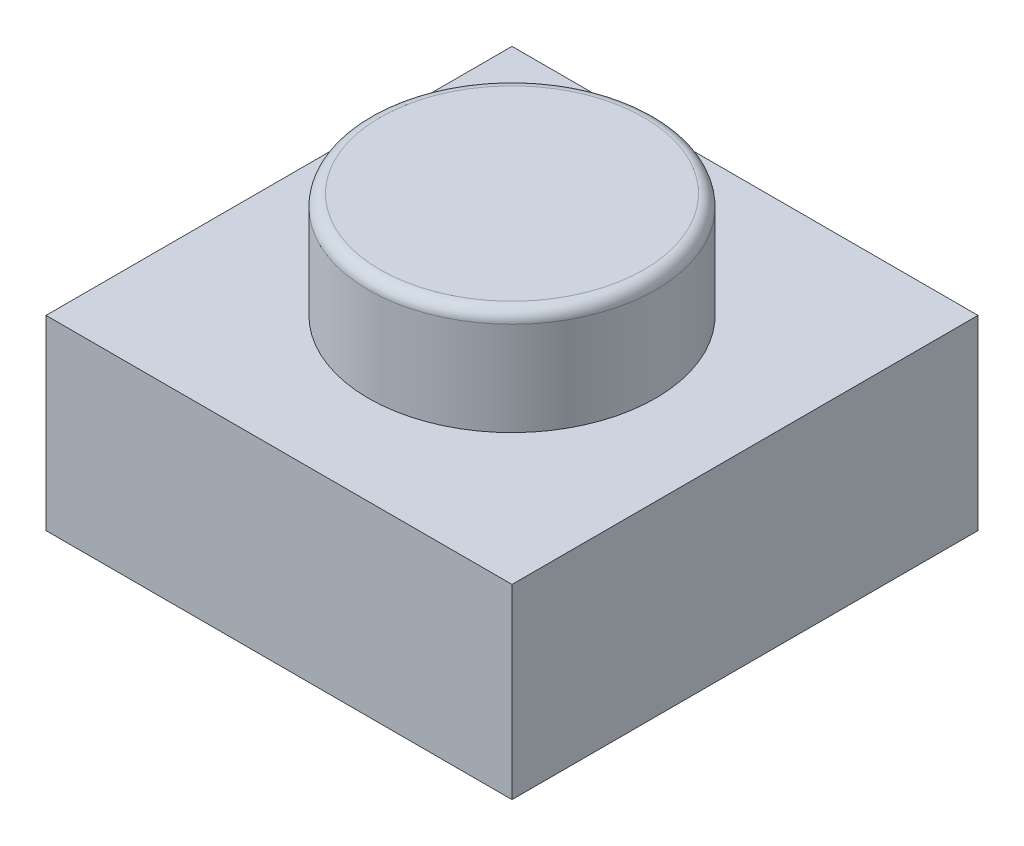
ISO-10303-21;
HEADER;
FILE_DESCRIPTION(('STEP AP214'),'2;1');
FILE_NAME('part.step','',(''),(''),'','','');
FILE_SCHEMA(('AUTOMOTIVE_DESIGN { 1 0 10303 214 1 1 1 1 }'));
ENDSEC;
DATA;
#1=APPLICATION_CONTEXT('core data for automotive mechanical design processes');
#2=APPLICATION_PROTOCOL_DEFINITION('international standard','automotive_design',2000,#1);
#3=PRODUCT_CONTEXT('',#1,'mechanical');
#4=PRODUCT('Part','Part','',(#3));
#5=PRODUCT_RELATED_PRODUCT_CATEGORY('part','',(#4));
#6=PRODUCT_DEFINITION_FORMATION('','',#4);
#7=PRODUCT_DEFINITION_CONTEXT('part definition',#1,'design');
#8=PRODUCT_DEFINITION('design','',#6,#7);
#9=PRODUCT_DEFINITION_SHAPE('','',#8);
#10=(LENGTH_UNIT() NAMED_UNIT(*) SI_UNIT(.MILLI.,.METRE.));
#11=(NAMED_UNIT(*) PLANE_ANGLE_UNIT() SI_UNIT($,.RADIAN.));
#12=(NAMED_UNIT(*) SI_UNIT($,.STERADIAN.) SOLID_ANGLE_UNIT());
#13=UNCERTAINTY_MEASURE_WITH_UNIT(LENGTH_MEASURE(1.E-05),#10,'distance_accuracy_value','');
#14=(GEOMETRIC_REPRESENTATION_CONTEXT(3) GLOBAL_UNCERTAINTY_ASSIGNED_CONTEXT((#13)) GLOBAL_UNIT_ASSIGNED_CONTEXT((#10,
#11,#12)) REPRESENTATION_CONTEXT('',''));
#15=CARTESIAN_POINT('',(0.,0.,0.));
#16=DIRECTION('',(0.,0.,1.));
#17=DIRECTION('',(1.,0.,0.));
#18=AXIS2_PLACEMENT_3D('',#15,#16,#17);
#19=CARTESIAN_POINT('',(23.6675908221797,3.18,-17.3288718929254));
#20=DIRECTION('',(0.,0.,-1.));
#21=DIRECTION('',(-1.,0.,0.));
#22=AXIS2_PLACEMENT_3D('',#19,#20,#21);
#23=PLANE('',#22);
#24=DIRECTION('',(1.,0.,0.));
#25=VECTOR('',#24,1.);
#26=CARTESIAN_POINT('',(23.6675908221797,0.,-17.3288718929254));
#27=LINE('',#26,#25);
#28=CARTESIAN_POINT('',(23.6675908221797,0.,-17.3288718929254));
#29=VERTEX_POINT('',#28);
#30=CARTESIAN_POINT('',(31.6175908221797,0.,-17.3288718929254));
#31=VERTEX_POINT('',#30);
#32=EDGE_CURVE('E103',#29,#31,#27,.T.);
#33=ORIENTED_EDGE('',*,*,#32,.F.);
#34=DIRECTION('',(0.,-1.,0.));
#35=VECTOR('',#34,1.);
#36=CARTESIAN_POINT('',(23.6675908221797,3.18,-17.3288718929254));
#37=LINE('',#36,#35);
#38=CARTESIAN_POINT('',(23.6675908221797,3.18,-17.3288718929254));
#39=VERTEX_POINT('',#38);
#40=EDGE_CURVE('E50',#39,#29,#37,.T.);
#41=ORIENTED_EDGE('',*,*,#40,.F.);
#42=DIRECTION('',(1.,0.,0.));
#43=VECTOR('',#42,1.);
#44=CARTESIAN_POINT('',(23.6675908221797,3.18,-17.3288718929254));
#45=LINE('',#44,#43);
#46=CARTESIAN_POINT('',(31.6175908221797,3.18,-17.3288718929254));
#47=VERTEX_POINT('',#46);
#48=EDGE_CURVE('E97',#39,#47,#45,.T.);
#49=ORIENTED_EDGE('',*,*,#48,.T.);
#50=DIRECTION('',(0.,-1.,0.));
#51=VECTOR('',#50,1.);
#52=CARTESIAN_POINT('',(31.6175908221797,3.18,-17.3288718929254));
#53=LINE('',#52,#51);
#54=EDGE_CURVE('E75',#47,#31,#53,.T.);
#55=ORIENTED_EDGE('',*,*,#54,.T.);
#56=EDGE_LOOP('',(#33,#41,#49,#55));
#57=FACE_BOUND('',#56,.T.);
#58=ADVANCED_FACE('F33',(#57),#23,.T.);
#59=CARTESIAN_POINT('',(23.6675908221797,3.18,-17.3288718929254));
#60=DIRECTION('',(1.,0.,0.));
#61=DIRECTION('',(0.,0.,-1.));
#62=AXIS2_PLACEMENT_3D('',#59,#60,#61);
#63=PLANE('',#62);
#64=DIRECTION('',(0.,0.,1.));
#65=VECTOR('',#64,1.);
#66=CARTESIAN_POINT('',(23.6675908221797,0.,-17.3288718929254));
#67=LINE('',#66,#65);
#68=CARTESIAN_POINT('',(23.6675908221797,0.,-9.37887189292543));
#69=VERTEX_POINT('',#68);
#70=EDGE_CURVE('E67',#29,#69,#67,.T.);
#71=ORIENTED_EDGE('',*,*,#70,.T.);
#72=DIRECTION('',(0.,-1.,0.));
#73=VECTOR('',#72,1.);
#74=CARTESIAN_POINT('',(23.6675908221797,3.18,-9.37887189292543));
#75=LINE('',#74,#73);
#76=CARTESIAN_POINT('',(23.6675908221797,3.18,-9.37887189292543));
#77=VERTEX_POINT('',#76);
#78=EDGE_CURVE('E94',#77,#69,#75,.T.);
#79=ORIENTED_EDGE('',*,*,#78,.F.);
#80=DIRECTION('',(0.,0.,1.));
#81=VECTOR('',#80,1.);
#82=CARTESIAN_POINT('',(23.6675908221797,3.18,-17.3288718929254));
#83=LINE('',#82,#81);
#84=EDGE_CURVE('E85',#39,#77,#83,.T.);
#85=ORIENTED_EDGE('',*,*,#84,.F.);
#86=ORIENTED_EDGE('',*,*,#40,.T.);
#87=EDGE_LOOP('',(#71,#79,#85,#86));
#88=FACE_BOUND('',#87,.T.);
#89=ADVANCED_FACE('F133',(#88),#63,.F.);
#90=CARTESIAN_POINT('',(23.6675908221797,3.18,-9.37887189292543));
#91=DIRECTION('',(0.,0.,-1.));
#92=DIRECTION('',(-1.,0.,0.));
#93=AXIS2_PLACEMENT_3D('',#90,#91,#92);
#94=PLANE('',#93);
#95=DIRECTION('',(1.,0.,0.));
#96=VECTOR('',#95,1.);
#97=CARTESIAN_POINT('',(23.6675908221797,0.,-9.37887189292543));
#98=LINE('',#97,#96);
#99=CARTESIAN_POINT('',(31.6175908221797,0.,-9.37887189292543));
#100=VERTEX_POINT('',#99);
#101=EDGE_CURVE('E92',#69,#100,#98,.T.);
#102=ORIENTED_EDGE('',*,*,#101,.T.);
#103=DIRECTION('',(0.,-1.,0.));
#104=VECTOR('',#103,1.);
#105=CARTESIAN_POINT('',(31.6175908221797,3.18,-9.37887189292543));
#106=LINE('',#105,#104);
#107=CARTESIAN_POINT('',(31.6175908221797,3.18,-9.37887189292543));
#108=VERTEX_POINT('',#107);
#109=EDGE_CURVE('E89',#108,#100,#106,.T.);
#110=ORIENTED_EDGE('',*,*,#109,.F.);
#111=DIRECTION('',(1.,0.,0.));
#112=VECTOR('',#111,1.);
#113=CARTESIAN_POINT('',(23.6675908221797,3.18,-9.37887189292543));
#114=LINE('',#113,#112);
#115=EDGE_CURVE('E80',#77,#108,#114,.T.);
#116=ORIENTED_EDGE('',*,*,#115,.F.);
#117=ORIENTED_EDGE('',*,*,#78,.T.);
#118=EDGE_LOOP('',(#102,#110,#116,#117));
#119=FACE_BOUND('',#118,.T.);
#120=ADVANCED_FACE('F90',(#119),#94,.F.);
#121=CARTESIAN_POINT('',(31.6175908221797,3.18,-17.3288718929254));
#122=DIRECTION('',(1.,0.,0.));
#123=DIRECTION('',(0.,0.,-1.));
#124=AXIS2_PLACEMENT_3D('',#121,#122,#123);
#125=PLANE('',#124);
#126=DIRECTION('',(0.,0.,1.));
#127=VECTOR('',#126,1.);
#128=CARTESIAN_POINT('',(31.6175908221797,0.,-17.3288718929254));
#129=LINE('',#128,#127);
#130=EDGE_CURVE('E106',#31,#100,#129,.T.);
#131=ORIENTED_EDGE('',*,*,#130,.F.);
#132=ORIENTED_EDGE('',*,*,#54,.F.);
#133=DIRECTION('',(0.,0.,1.));
#134=VECTOR('',#133,1.);
#135=CARTESIAN_POINT('',(31.6175908221797,3.18,-17.3288718929254));
#136=LINE('',#135,#134);
#137=EDGE_CURVE('E84',#47,#108,#136,.T.);
#138=ORIENTED_EDGE('',*,*,#137,.T.);
#139=ORIENTED_EDGE('',*,*,#109,.T.);
#140=EDGE_LOOP('',(#131,#132,#138,#139));
#141=FACE_BOUND('',#140,.T.);
#142=ADVANCED_FACE('F96',(#141),#125,.T.);
#143=CARTESIAN_POINT('',(0.,3.18,0.));
#144=DIRECTION('',(0.,-1.,0.));
#145=DIRECTION('',(0.,0.,-1.));
#146=AXIS2_PLACEMENT_3D('',#143,#144,#145);
#147=PLANE('',#146);
#148=CARTESIAN_POINT('',(27.6425908221797,3.18,-13.3538718929254));
#149=DIRECTION('',(0.,1.,0.));
#150=DIRECTION('',(0.,0.,1.));
#151=AXIS2_PLACEMENT_3D('',#148,#149,#150);
#152=CIRCLE('',#151,2.45);
#153=CARTESIAN_POINT('',(27.6425908221797,3.18,-10.9038718929254));
#154=VERTEX_POINT('',#153);
#155=EDGE_CURVE('E111',#154,#154,#152,.T.);
#156=ORIENTED_EDGE('',*,*,#155,.F.);
#157=EDGE_LOOP('',(#156));
#158=FACE_BOUND('',#157,.T.);
#159=ORIENTED_EDGE('',*,*,#48,.F.);
#160=ORIENTED_EDGE('',*,*,#84,.T.);
#161=ORIENTED_EDGE('',*,*,#115,.T.);
#162=ORIENTED_EDGE('',*,*,#137,.F.);
#163=EDGE_LOOP('',(#159,#160,#161,#162));
#164=FACE_BOUND('',#163,.T.);
#165=ADVANCED_FACE('F83',(#158,#164),#147,.F.);
#166=CARTESIAN_POINT('',(0.,0.,0.));
#167=DIRECTION('',(0.,-1.,0.));
#168=DIRECTION('',(0.,0.,-1.));
#169=AXIS2_PLACEMENT_3D('',#166,#167,#168);
#170=PLANE('',#169);
#171=ORIENTED_EDGE('',*,*,#32,.T.);
#172=ORIENTED_EDGE('',*,*,#130,.T.);
#173=ORIENTED_EDGE('',*,*,#101,.F.);
#174=ORIENTED_EDGE('',*,*,#70,.F.);
#175=EDGE_LOOP('',(#171,#172,#173,#174));
#176=FACE_BOUND('',#175,.T.);
#177=ADVANCED_FACE('F122',(#176),#170,.T.);
#178=CARTESIAN_POINT('',(27.6425908221797,4.98,-13.3538718929254));
#179=DIRECTION('',(0.,-1.,0.));
#180=DIRECTION('',(0.,0.,-1.));
#181=AXIS2_PLACEMENT_3D('',#178,#179,#180);
#182=CYLINDRICAL_SURFACE('',#181,2.45);
#183=CARTESIAN_POINT('',(27.6425908221797,4.78,-13.3538718929254));
#184=DIRECTION('',(0.,1.,0.));
#185=DIRECTION('',(0.,0.,1.));
#186=AXIS2_PLACEMENT_3D('',#183,#184,#185);
#187=CIRCLE('',#186,2.45);
#188=CARTESIAN_POINT('',(27.6425908221797,4.78,-10.9038718929254));
#189=VERTEX_POINT('',#188);
#190=EDGE_CURVE('E11',#189,#189,#187,.F.);
#191=ORIENTED_EDGE('',*,*,#190,.T.);
#192=EDGE_LOOP('',(#191));
#193=FACE_BOUND('',#192,.T.);
#194=ORIENTED_EDGE('',*,*,#155,.T.);
#195=EDGE_LOOP('',(#194));
#196=FACE_BOUND('',#195,.T.);
#197=ADVANCED_FACE('F119',(#193,#196),#182,.T.);
#198=CARTESIAN_POINT('',(27.6425908221797,4.98,-13.3538718929254));
#199=DIRECTION('',(0.,1.,0.));
#200=DIRECTION('',(0.,0.,1.));
#201=AXIS2_PLACEMENT_3D('',#198,#199,#200);
#202=PLANE('',#201);
#203=CARTESIAN_POINT('',(27.6425908221797,4.98,-13.3538718929254));
#204=DIRECTION('',(0.,1.,0.));
#205=DIRECTION('',(0.,0.,1.));
#206=AXIS2_PLACEMENT_3D('',#203,#204,#205);
#207=CIRCLE('',#206,2.25);
#208=CARTESIAN_POINT('',(27.6425908221797,4.98,-11.1038718929254));
#209=VERTEX_POINT('',#208);
#210=EDGE_CURVE('E42',#209,#209,#207,.T.);
#211=ORIENTED_EDGE('',*,*,#210,.T.);
#212=EDGE_LOOP('',(#211));
#213=FACE_BOUND('',#212,.T.);
#214=ADVANCED_FACE('F167',(#213),#202,.T.);
#215=CARTESIAN_POINT('',(27.6425908221797,4.78,-13.3538718929254));
#216=DIRECTION('',(0.,1.,0.));
#217=DIRECTION('',(0.,0.,1.));
#218=AXIS2_PLACEMENT_3D('',#215,#216,#217);
#219=TOROIDAL_SURFACE('',#218,2.25,0.2);
#220=ORIENTED_EDGE('',*,*,#190,.F.);
#221=EDGE_LOOP('',(#220));
#222=FACE_BOUND('',#221,.T.);
#223=ORIENTED_EDGE('',*,*,#210,.F.);
#224=EDGE_LOOP('',(#223));
#225=FACE_BOUND('',#224,.T.);
#226=ADVANCED_FACE('F35',(#222,#225),#219,.T.);
#227=CLOSED_SHELL('',(#58,#89,#120,#142,#165,#177,#197,#214,#226));
#228=MANIFOLD_SOLID_BREP('B2',#227);
#229=ADVANCED_BREP_SHAPE_REPRESENTATION('',(#18,#228),#14);
#230=SHAPE_DEFINITION_REPRESENTATION(#9,#229);
ENDSEC;
END-ISO-10303-21;
